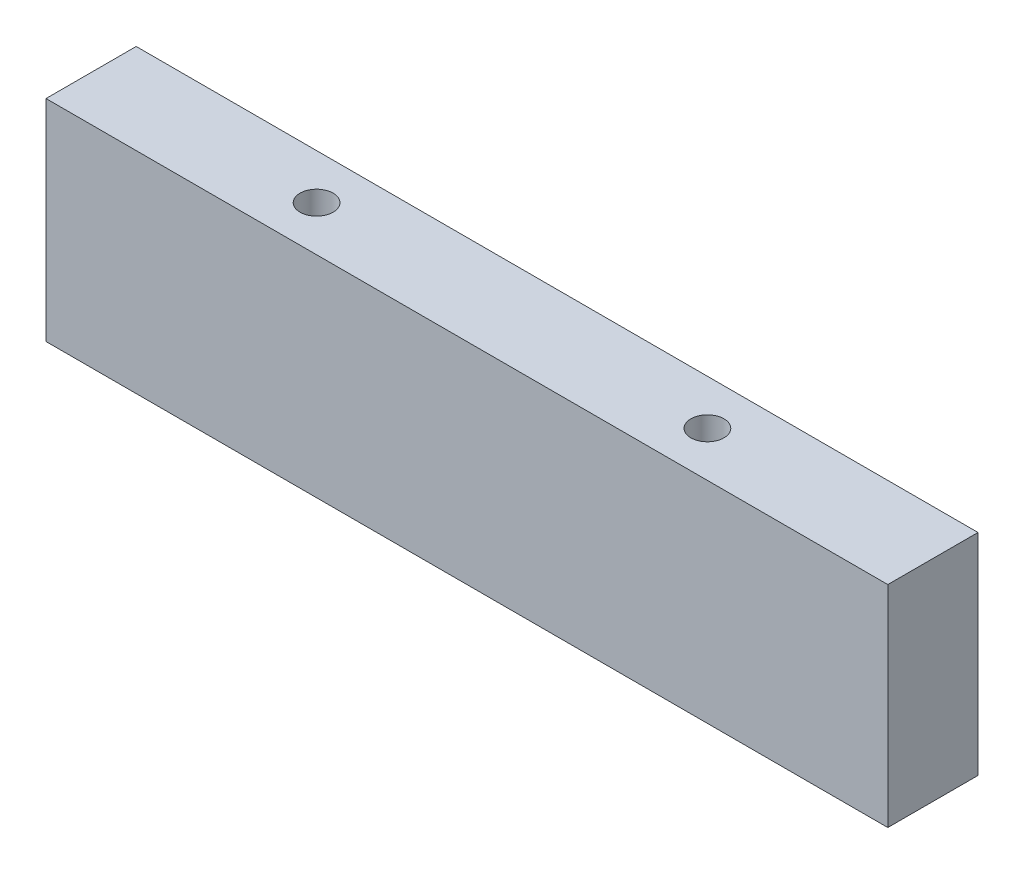
ISO-10303-21;
HEADER;
FILE_DESCRIPTION(('STEP AP214'),'2;1');
FILE_NAME('part.step','',(''),(''),'','','');
FILE_SCHEMA(('AUTOMOTIVE_DESIGN { 1 0 10303 214 1 1 1 1 }'));
ENDSEC;
DATA;
#1=APPLICATION_CONTEXT('core data for automotive mechanical design processes');
#2=APPLICATION_PROTOCOL_DEFINITION('international standard','automotive_design',2000,#1);
#3=PRODUCT_CONTEXT('',#1,'mechanical');
#4=PRODUCT('Part','Part','',(#3));
#5=PRODUCT_RELATED_PRODUCT_CATEGORY('part','',(#4));
#6=PRODUCT_DEFINITION_FORMATION('','',#4);
#7=PRODUCT_DEFINITION_CONTEXT('part definition',#1,'design');
#8=PRODUCT_DEFINITION('design','',#6,#7);
#9=PRODUCT_DEFINITION_SHAPE('','',#8);
#10=(LENGTH_UNIT() NAMED_UNIT(*) SI_UNIT(.MILLI.,.METRE.));
#11=(NAMED_UNIT(*) PLANE_ANGLE_UNIT() SI_UNIT($,.RADIAN.));
#12=(NAMED_UNIT(*) SI_UNIT($,.STERADIAN.) SOLID_ANGLE_UNIT());
#13=UNCERTAINTY_MEASURE_WITH_UNIT(LENGTH_MEASURE(1.E-05),#10,'distance_accuracy_value','');
#14=(GEOMETRIC_REPRESENTATION_CONTEXT(3) GLOBAL_UNCERTAINTY_ASSIGNED_CONTEXT((#13)) GLOBAL_UNIT_ASSIGNED_CONTEXT((#10,
#11,#12)) REPRESENTATION_CONTEXT('',''));
#15=CARTESIAN_POINT('',(0.,0.,0.));
#16=DIRECTION('',(0.,0.,1.));
#17=DIRECTION('',(1.,0.,0.));
#18=AXIS2_PLACEMENT_3D('',#15,#16,#17);
#19=CARTESIAN_POINT('',(140.,-35.,30.));
#20=DIRECTION('',(-1.,0.,0.));
#21=DIRECTION('',(0.,0.,1.));
#22=AXIS2_PLACEMENT_3D('',#19,#20,#21);
#23=PLANE('',#22);
#24=DIRECTION('',(0.,1.,0.));
#25=VECTOR('',#24,1.);
#26=CARTESIAN_POINT('',(140.,-35.,0.));
#27=LINE('',#26,#25);
#28=CARTESIAN_POINT('',(140.,-35.,0.));
#29=VERTEX_POINT('',#28);
#30=CARTESIAN_POINT('',(140.,35.,0.));
#31=VERTEX_POINT('',#30);
#32=EDGE_CURVE('E99',#29,#31,#27,.T.);
#33=ORIENTED_EDGE('',*,*,#32,.T.);
#34=DIRECTION('',(0.,0.,-1.));
#35=VECTOR('',#34,1.);
#36=CARTESIAN_POINT('',(140.,35.,30.));
#37=LINE('',#36,#35);
#38=CARTESIAN_POINT('',(140.,35.,30.));
#39=VERTEX_POINT('',#38);
#40=EDGE_CURVE('E11',#39,#31,#37,.T.);
#41=ORIENTED_EDGE('',*,*,#40,.F.);
#42=DIRECTION('',(0.,1.,0.));
#43=VECTOR('',#42,1.);
#44=CARTESIAN_POINT('',(140.,-35.,30.));
#45=LINE('',#44,#43);
#46=CARTESIAN_POINT('',(140.,-35.,30.));
#47=VERTEX_POINT('',#46);
#48=EDGE_CURVE('E86',#47,#39,#45,.T.);
#49=ORIENTED_EDGE('',*,*,#48,.F.);
#50=DIRECTION('',(0.,0.,-1.));
#51=VECTOR('',#50,1.);
#52=CARTESIAN_POINT('',(140.,-35.,30.));
#53=LINE('',#52,#51);
#54=EDGE_CURVE('E95',#47,#29,#53,.T.);
#55=ORIENTED_EDGE('',*,*,#54,.T.);
#56=EDGE_LOOP('',(#33,#41,#49,#55));
#57=FACE_BOUND('',#56,.T.);
#58=ADVANCED_FACE('F33',(#57),#23,.F.);
#59=CARTESIAN_POINT('',(-140.,35.,30.));
#60=DIRECTION('',(0.,-1.,0.));
#61=DIRECTION('',(0.,0.,-1.));
#62=AXIS2_PLACEMENT_3D('',#59,#60,#61);
#63=PLANE('',#62);
#64=CARTESIAN_POINT('',(-65.,35.,15.));
#65=DIRECTION('',(0.,1.,0.));
#66=DIRECTION('',(0.,0.,1.));
#67=AXIS2_PLACEMENT_3D('',#64,#65,#66);
#68=CIRCLE('',#67,5.49999999999999);
#69=CARTESIAN_POINT('',(-65.,35.,20.5));
#70=VERTEX_POINT('',#69);
#71=EDGE_CURVE('E108',#70,#70,#68,.T.);
#72=ORIENTED_EDGE('',*,*,#71,.F.);
#73=EDGE_LOOP('',(#72));
#74=FACE_BOUND('',#73,.T.);
#75=CARTESIAN_POINT('',(65.,35.,15.));
#76=DIRECTION('',(0.,1.,0.));
#77=DIRECTION('',(0.,0.,1.));
#78=AXIS2_PLACEMENT_3D('',#75,#76,#77);
#79=CIRCLE('',#78,5.49999999999999);
#80=CARTESIAN_POINT('',(65.,35.,20.5));
#81=VERTEX_POINT('',#80);
#82=EDGE_CURVE('E113',#81,#81,#79,.T.);
#83=ORIENTED_EDGE('',*,*,#82,.F.);
#84=EDGE_LOOP('',(#83));
#85=FACE_BOUND('',#84,.T.);
#86=DIRECTION('',(-1.,0.,0.));
#87=VECTOR('',#86,1.);
#88=CARTESIAN_POINT('',(-140.,35.,0.));
#89=LINE('',#88,#87);
#90=CARTESIAN_POINT('',(-140.,35.,0.));
#91=VERTEX_POINT('',#90);
#92=EDGE_CURVE('E90',#31,#91,#89,.T.);
#93=ORIENTED_EDGE('',*,*,#92,.T.);
#94=DIRECTION('',(0.,0.,-1.));
#95=VECTOR('',#94,1.);
#96=CARTESIAN_POINT('',(-140.,35.,30.));
#97=LINE('',#96,#95);
#98=CARTESIAN_POINT('',(-140.,35.,30.));
#99=VERTEX_POINT('',#98);
#100=EDGE_CURVE('E42',#99,#91,#97,.T.);
#101=ORIENTED_EDGE('',*,*,#100,.F.);
#102=DIRECTION('',(-1.,0.,0.));
#103=VECTOR('',#102,1.);
#104=CARTESIAN_POINT('',(-140.,35.,30.));
#105=LINE('',#104,#103);
#106=EDGE_CURVE('E81',#39,#99,#105,.T.);
#107=ORIENTED_EDGE('',*,*,#106,.F.);
#108=ORIENTED_EDGE('',*,*,#40,.T.);
#109=EDGE_LOOP('',(#93,#101,#107,#108));
#110=FACE_BOUND('',#109,.T.);
#111=ADVANCED_FACE('F89',(#74,#85,#110),#63,.F.);
#112=CARTESIAN_POINT('',(-140.,-35.,30.));
#113=DIRECTION('',(1.,0.,0.));
#114=DIRECTION('',(0.,0.,-1.));
#115=AXIS2_PLACEMENT_3D('',#112,#113,#114);
#116=PLANE('',#115);
#117=DIRECTION('',(0.,-1.,0.));
#118=VECTOR('',#117,1.);
#119=CARTESIAN_POINT('',(-140.,-35.,0.));
#120=LINE('',#119,#118);
#121=CARTESIAN_POINT('',(-140.,-35.,0.));
#122=VERTEX_POINT('',#121);
#123=EDGE_CURVE('E68',#91,#122,#120,.T.);
#124=ORIENTED_EDGE('',*,*,#123,.T.);
#125=DIRECTION('',(0.,0.,-1.));
#126=VECTOR('',#125,1.);
#127=CARTESIAN_POINT('',(-140.,-35.,30.));
#128=LINE('',#127,#126);
#129=CARTESIAN_POINT('',(-140.,-35.,30.));
#130=VERTEX_POINT('',#129);
#131=EDGE_CURVE('E91',#130,#122,#128,.T.);
#132=ORIENTED_EDGE('',*,*,#131,.F.);
#133=DIRECTION('',(0.,-1.,0.));
#134=VECTOR('',#133,1.);
#135=CARTESIAN_POINT('',(-140.,-35.,30.));
#136=LINE('',#135,#134);
#137=EDGE_CURVE('E84',#99,#130,#136,.T.);
#138=ORIENTED_EDGE('',*,*,#137,.F.);
#139=ORIENTED_EDGE('',*,*,#100,.T.);
#140=EDGE_LOOP('',(#124,#132,#138,#139));
#141=FACE_BOUND('',#140,.T.);
#142=ADVANCED_FACE('F93',(#141),#116,.F.);
#143=CARTESIAN_POINT('',(-140.,-35.,30.));
#144=DIRECTION('',(0.,1.,0.));
#145=DIRECTION('',(-1.,0.,0.));
#146=AXIS2_PLACEMENT_3D('',#143,#144,#145);
#147=PLANE('',#146);
#148=CARTESIAN_POINT('',(-65.,-35.,15.));
#149=DIRECTION('',(0.,1.,0.));
#150=DIRECTION('',(-1.,0.,0.));
#151=AXIS2_PLACEMENT_3D('',#148,#149,#150);
#152=CIRCLE('',#151,5.49999999999999);
#153=CARTESIAN_POINT('',(-70.5,-35.,15.));
#154=VERTEX_POINT('',#153);
#155=EDGE_CURVE('E36',#154,#154,#152,.T.);
#156=ORIENTED_EDGE('',*,*,#155,.T.);
#157=EDGE_LOOP('',(#156));
#158=FACE_BOUND('',#157,.T.);
#159=CARTESIAN_POINT('',(65.,-35.,15.));
#160=DIRECTION('',(0.,1.,0.));
#161=DIRECTION('',(-1.,0.,0.));
#162=AXIS2_PLACEMENT_3D('',#159,#160,#161);
#163=CIRCLE('',#162,5.49999999999999);
#164=CARTESIAN_POINT('',(59.5,-35.,15.));
#165=VERTEX_POINT('',#164);
#166=EDGE_CURVE('E106',#165,#165,#163,.T.);
#167=ORIENTED_EDGE('',*,*,#166,.T.);
#168=EDGE_LOOP('',(#167));
#169=FACE_BOUND('',#168,.T.);
#170=DIRECTION('',(1.,0.,0.));
#171=VECTOR('',#170,1.);
#172=CARTESIAN_POINT('',(-140.,-35.,0.));
#173=LINE('',#172,#171);
#174=EDGE_CURVE('E74',#122,#29,#173,.T.);
#175=ORIENTED_EDGE('',*,*,#174,.T.);
#176=ORIENTED_EDGE('',*,*,#54,.F.);
#177=DIRECTION('',(1.,0.,0.));
#178=VECTOR('',#177,1.);
#179=CARTESIAN_POINT('',(-140.,-35.,30.));
#180=LINE('',#179,#178);
#181=EDGE_CURVE('E51',#130,#47,#180,.T.);
#182=ORIENTED_EDGE('',*,*,#181,.F.);
#183=ORIENTED_EDGE('',*,*,#131,.T.);
#184=EDGE_LOOP('',(#175,#176,#182,#183));
#185=FACE_BOUND('',#184,.T.);
#186=ADVANCED_FACE('F130',(#158,#169,#185),#147,.F.);
#187=CARTESIAN_POINT('',(0.,0.,30.));
#188=DIRECTION('',(0.,0.,-1.));
#189=DIRECTION('',(-1.,0.,0.));
#190=AXIS2_PLACEMENT_3D('',#187,#188,#189);
#191=PLANE('',#190);
#192=ORIENTED_EDGE('',*,*,#48,.T.);
#193=ORIENTED_EDGE('',*,*,#106,.T.);
#194=ORIENTED_EDGE('',*,*,#137,.T.);
#195=ORIENTED_EDGE('',*,*,#181,.T.);
#196=EDGE_LOOP('',(#192,#193,#194,#195));
#197=FACE_BOUND('',#196,.T.);
#198=ADVANCED_FACE('F82',(#197),#191,.F.);
#199=CARTESIAN_POINT('',(0.,0.,0.));
#200=DIRECTION('',(0.,0.,-1.));
#201=DIRECTION('',(-1.,0.,0.));
#202=AXIS2_PLACEMENT_3D('',#199,#200,#201);
#203=PLANE('',#202);
#204=ORIENTED_EDGE('',*,*,#32,.F.);
#205=ORIENTED_EDGE('',*,*,#174,.F.);
#206=ORIENTED_EDGE('',*,*,#123,.F.);
#207=ORIENTED_EDGE('',*,*,#92,.F.);
#208=EDGE_LOOP('',(#204,#205,#206,#207));
#209=FACE_BOUND('',#208,.T.);
#210=ADVANCED_FACE('F137',(#209),#203,.T.);
#211=CARTESIAN_POINT('',(65.,-45.,15.));
#212=DIRECTION('',(0.,1.,0.));
#213=DIRECTION('',(0.,0.,1.));
#214=AXIS2_PLACEMENT_3D('',#211,#212,#213);
#215=CYLINDRICAL_SURFACE('',#214,5.49999999999999);
#216=ORIENTED_EDGE('',*,*,#82,.T.);
#217=EDGE_LOOP('',(#216));
#218=FACE_BOUND('',#217,.T.);
#219=ORIENTED_EDGE('',*,*,#166,.F.);
#220=EDGE_LOOP('',(#219));
#221=FACE_BOUND('',#220,.T.);
#222=ADVANCED_FACE('F121',(#218,#221),#215,.F.);
#223=CARTESIAN_POINT('',(-65.,-45.,15.));
#224=DIRECTION('',(0.,1.,0.));
#225=DIRECTION('',(0.,0.,1.));
#226=AXIS2_PLACEMENT_3D('',#223,#224,#225);
#227=CYLINDRICAL_SURFACE('',#226,5.49999999999999);
#228=ORIENTED_EDGE('',*,*,#71,.T.);
#229=EDGE_LOOP('',(#228));
#230=FACE_BOUND('',#229,.T.);
#231=ORIENTED_EDGE('',*,*,#155,.F.);
#232=EDGE_LOOP('',(#231));
#233=FACE_BOUND('',#232,.T.);
#234=ADVANCED_FACE('F145',(#230,#233),#227,.F.);
#235=CLOSED_SHELL('',(#58,#111,#142,#186,#198,#210,#222,#234));
#236=MANIFOLD_SOLID_BREP('B2',#235);
#237=ADVANCED_BREP_SHAPE_REPRESENTATION('',(#18,#236),#14);
#238=SHAPE_DEFINITION_REPRESENTATION(#9,#237);
ENDSEC;
END-ISO-10303-21;
